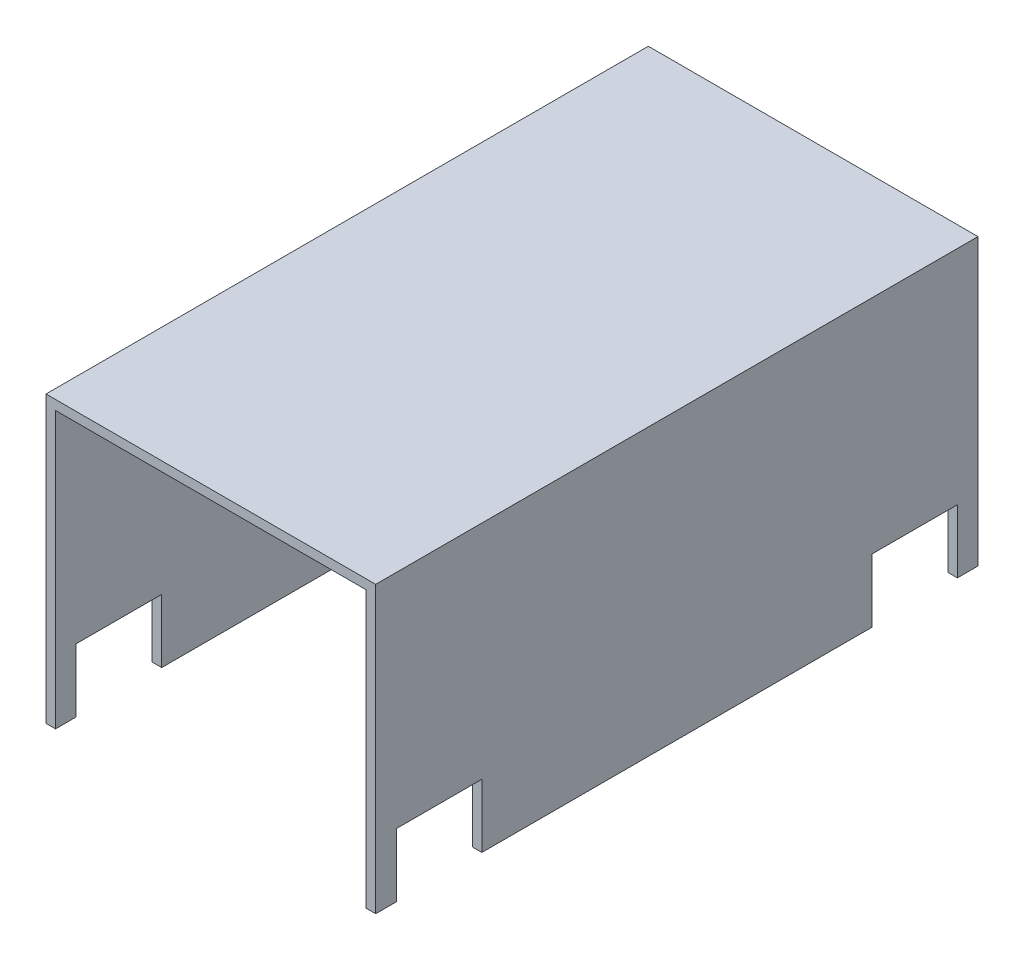
ISO-10303-21;
HEADER;
FILE_DESCRIPTION(('STEP AP214'),'2;1');
FILE_NAME('part.step','',(''),(''),'','','');
FILE_SCHEMA(('AUTOMOTIVE_DESIGN { 1 0 10303 214 1 1 1 1 }'));
ENDSEC;
DATA;
#1=APPLICATION_CONTEXT('core data for automotive mechanical design processes');
#2=APPLICATION_PROTOCOL_DEFINITION('international standard','automotive_design',2000,#1);
#3=PRODUCT_CONTEXT('',#1,'mechanical');
#4=PRODUCT('Part','Part','',(#3));
#5=PRODUCT_RELATED_PRODUCT_CATEGORY('part','',(#4));
#6=PRODUCT_DEFINITION_FORMATION('','',#4);
#7=PRODUCT_DEFINITION_CONTEXT('part definition',#1,'design');
#8=PRODUCT_DEFINITION('design','',#6,#7);
#9=PRODUCT_DEFINITION_SHAPE('','',#8);
#10=(LENGTH_UNIT() NAMED_UNIT(*) SI_UNIT(.MILLI.,.METRE.));
#11=(NAMED_UNIT(*) PLANE_ANGLE_UNIT() SI_UNIT($,.RADIAN.));
#12=(NAMED_UNIT(*) SI_UNIT($,.STERADIAN.) SOLID_ANGLE_UNIT());
#13=UNCERTAINTY_MEASURE_WITH_UNIT(LENGTH_MEASURE(1.E-05),#10,'distance_accuracy_value','');
#14=(GEOMETRIC_REPRESENTATION_CONTEXT(3) GLOBAL_UNCERTAINTY_ASSIGNED_CONTEXT((#13)) GLOBAL_UNIT_ASSIGNED_CONTEXT((#10,
#11,#12)) REPRESENTATION_CONTEXT('',''));
#15=CARTESIAN_POINT('',(0.,0.,0.));
#16=DIRECTION('',(0.,0.,1.));
#17=DIRECTION('',(1.,0.,0.));
#18=AXIS2_PLACEMENT_3D('',#15,#16,#17);
#19=CARTESIAN_POINT('',(52.,20.,-88.5));
#20=DIRECTION('',(0.,-1.,0.));
#21=DIRECTION('',(0.,0.,-1.));
#22=AXIS2_PLACEMENT_3D('',#19,#20,#21);
#23=PLANE('',#22);
#24=DIRECTION('',(0.,0.,1.));
#25=VECTOR('',#24,1.);
#26=CARTESIAN_POINT('',(49.,20.,3.25));
#27=LINE('',#26,#25);
#28=CARTESIAN_POINT('',(49.,20.,-88.5));
#29=VERTEX_POINT('',#28);
#30=CARTESIAN_POINT('',(49.,20.,-61.5));
#31=VERTEX_POINT('',#30);
#32=EDGE_CURVE('E40',#29,#31,#27,.T.);
#33=ORIENTED_EDGE('',*,*,#32,.F.);
#34=DIRECTION('',(-1.,0.,0.));
#35=VECTOR('',#34,1.);
#36=CARTESIAN_POINT('',(52.,20.,-88.5));
#37=LINE('',#36,#35);
#38=CARTESIAN_POINT('',(52.,20.,-88.5));
#39=VERTEX_POINT('',#38);
#40=EDGE_CURVE('E27',#39,#29,#37,.T.);
#41=ORIENTED_EDGE('',*,*,#40,.F.);
#42=DIRECTION('',(0.,0.,-1.));
#43=VECTOR('',#42,1.);
#44=CARTESIAN_POINT('',(52.,20.,3.25));
#45=LINE('',#44,#43);
#46=CARTESIAN_POINT('',(52.,20.,-61.5));
#47=VERTEX_POINT('',#46);
#48=EDGE_CURVE('E349',#47,#39,#45,.T.);
#49=ORIENTED_EDGE('',*,*,#48,.F.);
#50=DIRECTION('',(-1.,0.,0.));
#51=VECTOR('',#50,1.);
#52=CARTESIAN_POINT('',(52.,20.,-61.5));
#53=LINE('',#52,#51);
#54=EDGE_CURVE('E10',#47,#31,#53,.T.);
#55=ORIENTED_EDGE('',*,*,#54,.T.);
#56=EDGE_LOOP('',(#33,#41,#49,#55));
#57=FACE_BOUND('',#56,.T.);
#58=ADVANCED_FACE('F16',(#57),#23,.T.);
#59=CARTESIAN_POINT('',(52.,20.,-61.5));
#60=DIRECTION('',(0.,0.,-1.));
#61=DIRECTION('',(0.,-1.,0.));
#62=AXIS2_PLACEMENT_3D('',#59,#60,#61);
#63=PLANE('',#62);
#64=DIRECTION('',(0.,-1.,0.));
#65=VECTOR('',#64,1.);
#66=CARTESIAN_POINT('',(49.,53.5,-61.5));
#67=LINE('',#66,#65);
#68=CARTESIAN_POINT('',(49.,0.,-61.5));
#69=VERTEX_POINT('',#68);
#70=EDGE_CURVE('E205',#31,#69,#67,.T.);
#71=ORIENTED_EDGE('',*,*,#70,.F.);
#72=ORIENTED_EDGE('',*,*,#54,.F.);
#73=DIRECTION('',(0.,1.,0.));
#74=VECTOR('',#73,1.);
#75=CARTESIAN_POINT('',(52.,10.,-61.5));
#76=LINE('',#75,#74);
#77=CARTESIAN_POINT('',(52.,0.,-61.5));
#78=VERTEX_POINT('',#77);
#79=EDGE_CURVE('E348',#78,#47,#76,.T.);
#80=ORIENTED_EDGE('',*,*,#79,.F.);
#81=DIRECTION('',(1.,0.,0.));
#82=VECTOR('',#81,1.);
#83=CARTESIAN_POINT('',(26.,0.,-61.5));
#84=LINE('',#83,#82);
#85=EDGE_CURVE('E227',#69,#78,#84,.T.);
#86=ORIENTED_EDGE('',*,*,#85,.F.);
#87=EDGE_LOOP('',(#71,#72,#80,#86));
#88=FACE_BOUND('',#87,.T.);
#89=ADVANCED_FACE('F526',(#88),#63,.T.);
#90=CARTESIAN_POINT('',(52.,0.,-88.5));
#91=DIRECTION('',(0.,0.,1.));
#92=DIRECTION('',(0.,-1.,0.));
#93=AXIS2_PLACEMENT_3D('',#90,#91,#92);
#94=PLANE('',#93);
#95=DIRECTION('',(0.,1.,0.));
#96=VECTOR('',#95,1.);
#97=CARTESIAN_POINT('',(49.,43.5,-88.5));
#98=LINE('',#97,#96);
#99=CARTESIAN_POINT('',(49.,0.,-88.5));
#100=VERTEX_POINT('',#99);
#101=EDGE_CURVE('E249',#100,#29,#98,.T.);
#102=ORIENTED_EDGE('',*,*,#101,.F.);
#103=DIRECTION('',(-1.,0.,0.));
#104=VECTOR('',#103,1.);
#105=CARTESIAN_POINT('',(26.,0.,-88.5));
#106=LINE('',#105,#104);
#107=CARTESIAN_POINT('',(52.,0.,-88.5));
#108=VERTEX_POINT('',#107);
#109=EDGE_CURVE('E322',#108,#100,#106,.T.);
#110=ORIENTED_EDGE('',*,*,#109,.F.);
#111=DIRECTION('',(0.,-1.,0.));
#112=VECTOR('',#111,1.);
#113=CARTESIAN_POINT('',(52.,0.,-88.5));
#114=LINE('',#113,#112);
#115=EDGE_CURVE('E242',#39,#108,#114,.T.);
#116=ORIENTED_EDGE('',*,*,#115,.F.);
#117=ORIENTED_EDGE('',*,*,#40,.T.);
#118=EDGE_LOOP('',(#102,#110,#116,#117));
#119=FACE_BOUND('',#118,.T.);
#120=ADVANCED_FACE('F615',(#119),#94,.T.);
#121=CARTESIAN_POINT('',(52.,0.,-88.5));
#122=DIRECTION('',(0.,0.,1.));
#123=DIRECTION('',(0.,-1.,0.));
#124=AXIS2_PLACEMENT_3D('',#121,#122,#123);
#125=PLANE('',#124);
#126=DIRECTION('',(0.,-1.,0.));
#127=VECTOR('',#126,1.);
#128=CARTESIAN_POINT('',(-49.,0.,-88.5));
#129=LINE('',#128,#127);
#130=CARTESIAN_POINT('',(-49.,20.,-88.5));
#131=VERTEX_POINT('',#130);
#132=CARTESIAN_POINT('',(-49.,0.,-88.5));
#133=VERTEX_POINT('',#132);
#134=EDGE_CURVE('E372',#131,#133,#129,.T.);
#135=ORIENTED_EDGE('',*,*,#134,.F.);
#136=DIRECTION('',(-1.,0.,0.));
#137=VECTOR('',#136,1.);
#138=CARTESIAN_POINT('',(52.,20.,-88.5));
#139=LINE('',#138,#137);
#140=CARTESIAN_POINT('',(-52.,20.,-88.5));
#141=VERTEX_POINT('',#140);
#142=EDGE_CURVE('E266',#131,#141,#139,.T.);
#143=ORIENTED_EDGE('',*,*,#142,.T.);
#144=DIRECTION('',(0.,1.,0.));
#145=VECTOR('',#144,1.);
#146=CARTESIAN_POINT('',(-52.,0.,-88.5));
#147=LINE('',#146,#145);
#148=CARTESIAN_POINT('',(-52.,0.,-88.5));
#149=VERTEX_POINT('',#148);
#150=EDGE_CURVE('E211',#149,#141,#147,.T.);
#151=ORIENTED_EDGE('',*,*,#150,.F.);
#152=DIRECTION('',(-1.,0.,0.));
#153=VECTOR('',#152,1.);
#154=CARTESIAN_POINT('',(26.,0.,-88.5));
#155=LINE('',#154,#153);
#156=EDGE_CURVE('E314',#133,#149,#155,.T.);
#157=ORIENTED_EDGE('',*,*,#156,.F.);
#158=EDGE_LOOP('',(#135,#143,#151,#157));
#159=FACE_BOUND('',#158,.T.);
#160=ADVANCED_FACE('F620',(#159),#125,.T.);
#161=CARTESIAN_POINT('',(52.,20.,-61.5));
#162=DIRECTION('',(0.,0.,-1.));
#163=DIRECTION('',(0.,-1.,0.));
#164=AXIS2_PLACEMENT_3D('',#161,#162,#163);
#165=PLANE('',#164);
#166=DIRECTION('',(0.,1.,0.));
#167=VECTOR('',#166,1.);
#168=CARTESIAN_POINT('',(-49.,10.,-61.5));
#169=LINE('',#168,#167);
#170=CARTESIAN_POINT('',(-49.,0.,-61.5));
#171=VERTEX_POINT('',#170);
#172=CARTESIAN_POINT('',(-49.,20.,-61.5));
#173=VERTEX_POINT('',#172);
#174=EDGE_CURVE('E262',#171,#173,#169,.T.);
#175=ORIENTED_EDGE('',*,*,#174,.F.);
#176=DIRECTION('',(1.,0.,0.));
#177=VECTOR('',#176,1.);
#178=CARTESIAN_POINT('',(26.,0.,-61.5));
#179=LINE('',#178,#177);
#180=CARTESIAN_POINT('',(-52.,0.,-61.5));
#181=VERTEX_POINT('',#180);
#182=EDGE_CURVE('E341',#181,#171,#179,.T.);
#183=ORIENTED_EDGE('',*,*,#182,.F.);
#184=DIRECTION('',(0.,-1.,0.));
#185=VECTOR('',#184,1.);
#186=CARTESIAN_POINT('',(-52.,10.,-61.5));
#187=LINE('',#186,#185);
#188=CARTESIAN_POINT('',(-52.,20.,-61.5));
#189=VERTEX_POINT('',#188);
#190=EDGE_CURVE('E381',#189,#181,#187,.T.);
#191=ORIENTED_EDGE('',*,*,#190,.F.);
#192=DIRECTION('',(-1.,0.,0.));
#193=VECTOR('',#192,1.);
#194=CARTESIAN_POINT('',(52.,20.,-61.5));
#195=LINE('',#194,#193);
#196=EDGE_CURVE('E252',#173,#189,#195,.T.);
#197=ORIENTED_EDGE('',*,*,#196,.F.);
#198=EDGE_LOOP('',(#175,#183,#191,#197));
#199=FACE_BOUND('',#198,.T.);
#200=ADVANCED_FACE('F654',(#199),#165,.T.);
#201=CARTESIAN_POINT('',(52.,20.,-88.5));
#202=DIRECTION('',(0.,-1.,0.));
#203=DIRECTION('',(0.,0.,-1.));
#204=AXIS2_PLACEMENT_3D('',#201,#202,#203);
#205=PLANE('',#204);
#206=DIRECTION('',(0.,0.,-1.));
#207=VECTOR('',#206,1.);
#208=CARTESIAN_POINT('',(-49.,20.,3.25000000000004));
#209=LINE('',#208,#207);
#210=EDGE_CURVE('E310',#173,#131,#209,.T.);
#211=ORIENTED_EDGE('',*,*,#210,.F.);
#212=ORIENTED_EDGE('',*,*,#196,.T.);
#213=DIRECTION('',(0.,0.,1.));
#214=VECTOR('',#213,1.);
#215=CARTESIAN_POINT('',(-52.,20.,-91.75));
#216=LINE('',#215,#214);
#217=EDGE_CURVE('E385',#141,#189,#216,.T.);
#218=ORIENTED_EDGE('',*,*,#217,.F.);
#219=ORIENTED_EDGE('',*,*,#142,.F.);
#220=EDGE_LOOP('',(#211,#212,#218,#219));
#221=FACE_BOUND('',#220,.T.);
#222=ADVANCED_FACE('F673',(#221),#205,.T.);
#223=CARTESIAN_POINT('',(49.,87.,95.));
#224=DIRECTION('',(1.,0.,0.));
#225=DIRECTION('',(0.,1.,0.));
#226=AXIS2_PLACEMENT_3D('',#223,#224,#225);
#227=PLANE('',#226);
#228=ORIENTED_EDGE('',*,*,#101,.T.);
#229=ORIENTED_EDGE('',*,*,#32,.T.);
#230=ORIENTED_EDGE('',*,*,#70,.T.);
#231=DIRECTION('',(0.,0.,-1.));
#232=VECTOR('',#231,1.);
#233=CARTESIAN_POINT('',(49.,0.,47.5));
#234=LINE('',#233,#232);
#235=CARTESIAN_POINT('',(49.,0.,61.5));
#236=VERTEX_POINT('',#235);
#237=EDGE_CURVE('E197',#236,#69,#234,.T.);
#238=ORIENTED_EDGE('',*,*,#237,.F.);
#239=DIRECTION('',(0.,1.,0.));
#240=VECTOR('',#239,1.);
#241=CARTESIAN_POINT('',(49.,53.5,61.5));
#242=LINE('',#241,#240);
#243=CARTESIAN_POINT('',(49.,20.,61.5));
#244=VERTEX_POINT('',#243);
#245=EDGE_CURVE('E202',#236,#244,#242,.T.);
#246=ORIENTED_EDGE('',*,*,#245,.T.);
#247=DIRECTION('',(0.,0.,1.));
#248=VECTOR('',#247,1.);
#249=CARTESIAN_POINT('',(49.,20.,91.75));
#250=LINE('',#249,#248);
#251=CARTESIAN_POINT('',(49.,20.,88.5));
#252=VERTEX_POINT('',#251);
#253=EDGE_CURVE('E221',#244,#252,#250,.T.);
#254=ORIENTED_EDGE('',*,*,#253,.T.);
#255=DIRECTION('',(0.,-1.,0.));
#256=VECTOR('',#255,1.);
#257=CARTESIAN_POINT('',(49.,43.5,88.5));
#258=LINE('',#257,#256);
#259=CARTESIAN_POINT('',(49.,0.,88.5));
#260=VERTEX_POINT('',#259);
#261=EDGE_CURVE('E315',#252,#260,#258,.T.);
#262=ORIENTED_EDGE('',*,*,#261,.T.);
#263=DIRECTION('',(0.,0.,-1.));
#264=VECTOR('',#263,1.);
#265=CARTESIAN_POINT('',(49.,0.,47.5));
#266=LINE('',#265,#264);
#267=CARTESIAN_POINT('',(49.,0.,95.));
#268=VERTEX_POINT('',#267);
#269=EDGE_CURVE('E239',#268,#260,#266,.T.);
#270=ORIENTED_EDGE('',*,*,#269,.F.);
#271=DIRECTION('',(0.,-1.,0.));
#272=VECTOR('',#271,1.);
#273=CARTESIAN_POINT('',(49.,43.5,95.));
#274=LINE('',#273,#272);
#275=CARTESIAN_POINT('',(49.,87.,95.));
#276=VERTEX_POINT('',#275);
#277=EDGE_CURVE('E282',#276,#268,#274,.T.);
#278=ORIENTED_EDGE('',*,*,#277,.F.);
#279=DIRECTION('',(0.,0.,-1.));
#280=VECTOR('',#279,1.);
#281=CARTESIAN_POINT('',(49.,87.,95.));
#282=LINE('',#281,#280);
#283=CARTESIAN_POINT('',(49.,87.,-95.));
#284=VERTEX_POINT('',#283);
#285=EDGE_CURVE('E233',#276,#284,#282,.T.);
#286=ORIENTED_EDGE('',*,*,#285,.T.);
#287=DIRECTION('',(0.,1.,0.));
#288=VECTOR('',#287,1.);
#289=CARTESIAN_POINT('',(49.,43.5,-95.));
#290=LINE('',#289,#288);
#291=CARTESIAN_POINT('',(49.,0.,-95.));
#292=VERTEX_POINT('',#291);
#293=EDGE_CURVE('E287',#292,#284,#290,.T.);
#294=ORIENTED_EDGE('',*,*,#293,.F.);
#295=DIRECTION('',(0.,0.,-1.));
#296=VECTOR('',#295,1.);
#297=CARTESIAN_POINT('',(49.,0.,47.5));
#298=LINE('',#297,#296);
#299=EDGE_CURVE('E319',#100,#292,#298,.T.);
#300=ORIENTED_EDGE('',*,*,#299,.F.);
#301=EDGE_LOOP('',(#228,#229,#230,#238,#246,#254,#262,#270,#278,#286,#294,#300));
#302=FACE_BOUND('',#301,.T.);
#303=ADVANCED_FACE('F200',(#302),#227,.F.);
#304=CARTESIAN_POINT('',(0.,0.,0.));
#305=DIRECTION('',(0.,1.,0.));
#306=DIRECTION('',(1.,0.,0.));
#307=AXIS2_PLACEMENT_3D('',#304,#305,#306);
#308=PLANE('',#307);
#309=ORIENTED_EDGE('',*,*,#85,.T.);
#310=DIRECTION('',(0.,0.,-1.));
#311=VECTOR('',#310,1.);
#312=CARTESIAN_POINT('',(52.,0.,95.));
#313=LINE('',#312,#311);
#314=CARTESIAN_POINT('',(52.,0.,61.5));
#315=VERTEX_POINT('',#314);
#316=EDGE_CURVE('E225',#315,#78,#313,.T.);
#317=ORIENTED_EDGE('',*,*,#316,.F.);
#318=DIRECTION('',(-1.,0.,0.));
#319=VECTOR('',#318,1.);
#320=CARTESIAN_POINT('',(26.,0.,61.5));
#321=LINE('',#320,#319);
#322=EDGE_CURVE('E210',#315,#236,#321,.T.);
#323=ORIENTED_EDGE('',*,*,#322,.T.);
#324=ORIENTED_EDGE('',*,*,#237,.T.);
#325=EDGE_LOOP('',(#309,#317,#323,#324));
#326=FACE_BOUND('',#325,.T.);
#327=ADVANCED_FACE('F223',(#326),#308,.F.);
#328=CARTESIAN_POINT('',(-52.,0.,-95.));
#329=DIRECTION('',(-1.,0.,0.));
#330=DIRECTION('',(0.,1.,0.));
#331=AXIS2_PLACEMENT_3D('',#328,#329,#330);
#332=PLANE('',#331);
#333=ORIENTED_EDGE('',*,*,#150,.T.);
#334=ORIENTED_EDGE('',*,*,#217,.T.);
#335=ORIENTED_EDGE('',*,*,#190,.T.);
#336=DIRECTION('',(0.,0.,1.));
#337=VECTOR('',#336,1.);
#338=CARTESIAN_POINT('',(-52.,0.,-95.));
#339=LINE('',#338,#337);
#340=CARTESIAN_POINT('',(-52.,0.,61.5));
#341=VERTEX_POINT('',#340);
#342=EDGE_CURVE('E296',#181,#341,#339,.T.);
#343=ORIENTED_EDGE('',*,*,#342,.T.);
#344=DIRECTION('',(0.,1.,0.));
#345=VECTOR('',#344,1.);
#346=CARTESIAN_POINT('',(-52.,10.,61.5));
#347=LINE('',#346,#345);
#348=CARTESIAN_POINT('',(-52.,20.,61.5));
#349=VERTEX_POINT('',#348);
#350=EDGE_CURVE('E292',#341,#349,#347,.T.);
#351=ORIENTED_EDGE('',*,*,#350,.T.);
#352=DIRECTION('',(0.,0.,1.));
#353=VECTOR('',#352,1.);
#354=CARTESIAN_POINT('',(-52.,20.,-3.25));
#355=LINE('',#354,#353);
#356=CARTESIAN_POINT('',(-52.,20.,88.5));
#357=VERTEX_POINT('',#356);
#358=EDGE_CURVE('E271',#349,#357,#355,.T.);
#359=ORIENTED_EDGE('',*,*,#358,.T.);
#360=DIRECTION('',(0.,-1.,0.));
#361=VECTOR('',#360,1.);
#362=CARTESIAN_POINT('',(-52.,0.,88.5));
#363=LINE('',#362,#361);
#364=CARTESIAN_POINT('',(-52.,0.,88.5));
#365=VERTEX_POINT('',#364);
#366=EDGE_CURVE('E267',#357,#365,#363,.T.);
#367=ORIENTED_EDGE('',*,*,#366,.T.);
#368=DIRECTION('',(0.,0.,1.));
#369=VECTOR('',#368,1.);
#370=CARTESIAN_POINT('',(-52.,0.,-95.));
#371=LINE('',#370,#369);
#372=CARTESIAN_POINT('',(-52.,0.,95.));
#373=VERTEX_POINT('',#372);
#374=EDGE_CURVE('E272',#365,#373,#371,.T.);
#375=ORIENTED_EDGE('',*,*,#374,.T.);
#376=DIRECTION('',(0.,1.,0.));
#377=VECTOR('',#376,1.);
#378=CARTESIAN_POINT('',(-52.,0.,95.));
#379=LINE('',#378,#377);
#380=CARTESIAN_POINT('',(-52.,90.,95.));
#381=VERTEX_POINT('',#380);
#382=EDGE_CURVE('E286',#373,#381,#379,.T.);
#383=ORIENTED_EDGE('',*,*,#382,.T.);
#384=DIRECTION('',(0.,0.,1.));
#385=VECTOR('',#384,1.);
#386=CARTESIAN_POINT('',(-52.,90.,-95.));
#387=LINE('',#386,#385);
#388=CARTESIAN_POINT('',(-52.,90.,-95.));
#389=VERTEX_POINT('',#388);
#390=EDGE_CURVE('E333',#389,#381,#387,.T.);
#391=ORIENTED_EDGE('',*,*,#390,.F.);
#392=DIRECTION('',(0.,1.,0.));
#393=VECTOR('',#392,1.);
#394=CARTESIAN_POINT('',(-52.,0.,-95.));
#395=LINE('',#394,#393);
#396=CARTESIAN_POINT('',(-52.,0.,-95.));
#397=VERTEX_POINT('',#396);
#398=EDGE_CURVE('E393',#397,#389,#395,.T.);
#399=ORIENTED_EDGE('',*,*,#398,.F.);
#400=DIRECTION('',(0.,0.,1.));
#401=VECTOR('',#400,1.);
#402=CARTESIAN_POINT('',(-52.,0.,-95.));
#403=LINE('',#402,#401);
#404=EDGE_CURVE('E300',#397,#149,#403,.T.);
#405=ORIENTED_EDGE('',*,*,#404,.T.);
#406=EDGE_LOOP('',(#333,#334,#335,#343,#351,#359,#367,#375,#383,#391,#399,#405));
#407=FACE_BOUND('',#406,.T.);
#408=ADVANCED_FACE('F662',(#407),#332,.T.);
#409=CARTESIAN_POINT('',(0.,0.,0.));
#410=DIRECTION('',(0.,1.,0.));
#411=DIRECTION('',(1.,0.,0.));
#412=AXIS2_PLACEMENT_3D('',#409,#410,#411);
#413=PLANE('',#412);
#414=ORIENTED_EDGE('',*,*,#182,.T.);
#415=DIRECTION('',(0.,0.,1.));
#416=VECTOR('',#415,1.);
#417=CARTESIAN_POINT('',(-49.,0.,47.5));
#418=LINE('',#417,#416);
#419=CARTESIAN_POINT('',(-49.,0.,61.5));
#420=VERTEX_POINT('',#419);
#421=EDGE_CURVE('E277',#171,#420,#418,.T.);
#422=ORIENTED_EDGE('',*,*,#421,.T.);
#423=DIRECTION('',(-1.,0.,0.));
#424=VECTOR('',#423,1.);
#425=CARTESIAN_POINT('',(26.,0.,61.5));
#426=LINE('',#425,#424);
#427=EDGE_CURVE('E273',#420,#341,#426,.T.);
#428=ORIENTED_EDGE('',*,*,#427,.T.);
#429=ORIENTED_EDGE('',*,*,#342,.F.);
#430=EDGE_LOOP('',(#414,#422,#428,#429));
#431=FACE_BOUND('',#430,.T.);
#432=ADVANCED_FACE('F643',(#431),#413,.F.);
#433=CARTESIAN_POINT('',(52.,20.,88.5));
#434=DIRECTION('',(0.,1.,0.));
#435=DIRECTION('',(1.,0.,0.));
#436=AXIS2_PLACEMENT_3D('',#433,#434,#435);
#437=PLANE('',#436);
#438=ORIENTED_EDGE('',*,*,#253,.F.);
#439=DIRECTION('',(-1.,0.,0.));
#440=VECTOR('',#439,1.);
#441=CARTESIAN_POINT('',(52.,20.,61.5));
#442=LINE('',#441,#440);
#443=CARTESIAN_POINT('',(52.,20.,61.5));
#444=VERTEX_POINT('',#443);
#445=EDGE_CURVE('E219',#444,#244,#442,.T.);
#446=ORIENTED_EDGE('',*,*,#445,.F.);
#447=DIRECTION('',(0.,0.,-1.));
#448=VECTOR('',#447,1.);
#449=CARTESIAN_POINT('',(52.,20.,91.75));
#450=LINE('',#449,#448);
#451=CARTESIAN_POINT('',(52.,20.,88.5));
#452=VERTEX_POINT('',#451);
#453=EDGE_CURVE('E390',#452,#444,#450,.T.);
#454=ORIENTED_EDGE('',*,*,#453,.F.);
#455=DIRECTION('',(-1.,0.,0.));
#456=VECTOR('',#455,1.);
#457=CARTESIAN_POINT('',(52.,20.,88.5));
#458=LINE('',#457,#456);
#459=EDGE_CURVE('E278',#452,#252,#458,.T.);
#460=ORIENTED_EDGE('',*,*,#459,.T.);
#461=EDGE_LOOP('',(#438,#446,#454,#460));
#462=FACE_BOUND('',#461,.T.);
#463=ADVANCED_FACE('F519',(#462),#437,.F.);
#464=CARTESIAN_POINT('',(52.,20.,88.5));
#465=DIRECTION('',(0.,1.,0.));
#466=DIRECTION('',(1.,0.,0.));
#467=AXIS2_PLACEMENT_3D('',#464,#465,#466);
#468=PLANE('',#467);
#469=DIRECTION('',(0.,0.,-1.));
#470=VECTOR('',#469,1.);
#471=CARTESIAN_POINT('',(-49.,20.,91.75));
#472=LINE('',#471,#470);
#473=CARTESIAN_POINT('',(-49.,20.,88.5));
#474=VERTEX_POINT('',#473);
#475=CARTESIAN_POINT('',(-49.,20.,61.5));
#476=VERTEX_POINT('',#475);
#477=EDGE_CURVE('E244',#474,#476,#472,.T.);
#478=ORIENTED_EDGE('',*,*,#477,.F.);
#479=DIRECTION('',(-1.,0.,0.));
#480=VECTOR('',#479,1.);
#481=CARTESIAN_POINT('',(52.,20.,88.5));
#482=LINE('',#481,#480);
#483=EDGE_CURVE('E440',#474,#357,#482,.T.);
#484=ORIENTED_EDGE('',*,*,#483,.T.);
#485=ORIENTED_EDGE('',*,*,#358,.F.);
#486=DIRECTION('',(-1.,0.,0.));
#487=VECTOR('',#486,1.);
#488=CARTESIAN_POINT('',(52.,20.,61.5));
#489=LINE('',#488,#487);
#490=EDGE_CURVE('E441',#476,#349,#489,.T.);
#491=ORIENTED_EDGE('',*,*,#490,.F.);
#492=EDGE_LOOP('',(#478,#484,#485,#491));
#493=FACE_BOUND('',#492,.T.);
#494=ADVANCED_FACE('F642',(#493),#468,.F.);
#495=CARTESIAN_POINT('',(52.,20.,61.5));
#496=DIRECTION('',(0.,0.,-1.));
#497=DIRECTION('',(0.,-1.,0.));
#498=AXIS2_PLACEMENT_3D('',#495,#496,#497);
#499=PLANE('',#498);
#500=ORIENTED_EDGE('',*,*,#245,.F.);
#501=ORIENTED_EDGE('',*,*,#322,.F.);
#502=DIRECTION('',(0.,-1.,0.));
#503=VECTOR('',#502,1.);
#504=CARTESIAN_POINT('',(52.,10.,61.5));
#505=LINE('',#504,#503);
#506=EDGE_CURVE('E347',#444,#315,#505,.T.);
#507=ORIENTED_EDGE('',*,*,#506,.F.);
#508=ORIENTED_EDGE('',*,*,#445,.T.);
#509=EDGE_LOOP('',(#500,#501,#507,#508));
#510=FACE_BOUND('',#509,.T.);
#511=ADVANCED_FACE('F215',(#510),#499,.F.);
#512=CARTESIAN_POINT('',(52.,20.,61.5));
#513=DIRECTION('',(0.,0.,-1.));
#514=DIRECTION('',(0.,-1.,0.));
#515=AXIS2_PLACEMENT_3D('',#512,#513,#514);
#516=PLANE('',#515);
#517=DIRECTION('',(0.,-1.,0.));
#518=VECTOR('',#517,1.);
#519=CARTESIAN_POINT('',(-49.,10.,61.5));
#520=LINE('',#519,#518);
#521=EDGE_CURVE('E248',#476,#420,#520,.T.);
#522=ORIENTED_EDGE('',*,*,#521,.F.);
#523=ORIENTED_EDGE('',*,*,#490,.T.);
#524=ORIENTED_EDGE('',*,*,#350,.F.);
#525=ORIENTED_EDGE('',*,*,#427,.F.);
#526=EDGE_LOOP('',(#522,#523,#524,#525));
#527=FACE_BOUND('',#526,.T.);
#528=ADVANCED_FACE('F585',(#527),#516,.F.);
#529=CARTESIAN_POINT('',(52.,0.,88.5));
#530=DIRECTION('',(0.,0.,1.));
#531=DIRECTION('',(0.,-1.,0.));
#532=AXIS2_PLACEMENT_3D('',#529,#530,#531);
#533=PLANE('',#532);
#534=ORIENTED_EDGE('',*,*,#261,.F.);
#535=ORIENTED_EDGE('',*,*,#459,.F.);
#536=DIRECTION('',(0.,1.,0.));
#537=VECTOR('',#536,1.);
#538=CARTESIAN_POINT('',(52.,0.,88.5));
#539=LINE('',#538,#537);
#540=CARTESIAN_POINT('',(52.,0.,88.5));
#541=VERTEX_POINT('',#540);
#542=EDGE_CURVE('E20',#541,#452,#539,.T.);
#543=ORIENTED_EDGE('',*,*,#542,.F.);
#544=DIRECTION('',(1.,0.,0.));
#545=VECTOR('',#544,1.);
#546=CARTESIAN_POINT('',(26.,0.,88.5));
#547=LINE('',#546,#545);
#548=EDGE_CURVE('E241',#260,#541,#547,.T.);
#549=ORIENTED_EDGE('',*,*,#548,.F.);
#550=EDGE_LOOP('',(#534,#535,#543,#549));
#551=FACE_BOUND('',#550,.T.);
#552=ADVANCED_FACE('F514',(#551),#533,.F.);
#553=CARTESIAN_POINT('',(52.,0.,88.5));
#554=DIRECTION('',(0.,0.,1.));
#555=DIRECTION('',(0.,-1.,0.));
#556=AXIS2_PLACEMENT_3D('',#553,#554,#555);
#557=PLANE('',#556);
#558=DIRECTION('',(0.,1.,0.));
#559=VECTOR('',#558,1.);
#560=CARTESIAN_POINT('',(-49.,0.,88.5));
#561=LINE('',#560,#559);
#562=CARTESIAN_POINT('',(-49.,0.,88.5));
#563=VERTEX_POINT('',#562);
#564=EDGE_CURVE('E247',#563,#474,#561,.T.);
#565=ORIENTED_EDGE('',*,*,#564,.F.);
#566=DIRECTION('',(1.,0.,0.));
#567=VECTOR('',#566,1.);
#568=CARTESIAN_POINT('',(26.,0.,88.5));
#569=LINE('',#568,#567);
#570=EDGE_CURVE('E323',#365,#563,#569,.T.);
#571=ORIENTED_EDGE('',*,*,#570,.F.);
#572=ORIENTED_EDGE('',*,*,#366,.F.);
#573=ORIENTED_EDGE('',*,*,#483,.F.);
#574=EDGE_LOOP('',(#565,#571,#572,#573));
#575=FACE_BOUND('',#574,.T.);
#576=ADVANCED_FACE('F705',(#575),#557,.F.);
#577=CARTESIAN_POINT('',(-49.,0.,95.));
#578=DIRECTION('',(-1.,0.,0.));
#579=DIRECTION('',(0.,1.,0.));
#580=AXIS2_PLACEMENT_3D('',#577,#578,#579);
#581=PLANE('',#580);
#582=ORIENTED_EDGE('',*,*,#134,.T.);
#583=DIRECTION('',(0.,0.,1.));
#584=VECTOR('',#583,1.);
#585=CARTESIAN_POINT('',(-49.,0.,47.5));
#586=LINE('',#585,#584);
#587=CARTESIAN_POINT('',(-49.,0.,-95.));
#588=VERTEX_POINT('',#587);
#589=EDGE_CURVE('E325',#588,#133,#586,.T.);
#590=ORIENTED_EDGE('',*,*,#589,.F.);
#591=DIRECTION('',(0.,-1.,0.));
#592=VECTOR('',#591,1.);
#593=CARTESIAN_POINT('',(-49.,0.,-95.));
#594=LINE('',#593,#592);
#595=CARTESIAN_POINT('',(-49.,87.,-95.));
#596=VERTEX_POINT('',#595);
#597=EDGE_CURVE('E237',#596,#588,#594,.T.);
#598=ORIENTED_EDGE('',*,*,#597,.F.);
#599=DIRECTION('',(0.,0.,-1.));
#600=VECTOR('',#599,1.);
#601=CARTESIAN_POINT('',(-49.,87.,95.));
#602=LINE('',#601,#600);
#603=CARTESIAN_POINT('',(-49.,87.,95.));
#604=VERTEX_POINT('',#603);
#605=EDGE_CURVE('E352',#604,#596,#602,.T.);
#606=ORIENTED_EDGE('',*,*,#605,.F.);
#607=DIRECTION('',(0.,1.,0.));
#608=VECTOR('',#607,1.);
#609=CARTESIAN_POINT('',(-49.,0.,95.));
#610=LINE('',#609,#608);
#611=CARTESIAN_POINT('',(-49.,0.,95.));
#612=VERTEX_POINT('',#611);
#613=EDGE_CURVE('E164',#612,#604,#610,.T.);
#614=ORIENTED_EDGE('',*,*,#613,.F.);
#615=DIRECTION('',(0.,0.,1.));
#616=VECTOR('',#615,1.);
#617=CARTESIAN_POINT('',(-49.,0.,47.5));
#618=LINE('',#617,#616);
#619=EDGE_CURVE('E303',#563,#612,#618,.T.);
#620=ORIENTED_EDGE('',*,*,#619,.F.);
#621=ORIENTED_EDGE('',*,*,#564,.T.);
#622=ORIENTED_EDGE('',*,*,#477,.T.);
#623=ORIENTED_EDGE('',*,*,#521,.T.);
#624=ORIENTED_EDGE('',*,*,#421,.F.);
#625=ORIENTED_EDGE('',*,*,#174,.T.);
#626=ORIENTED_EDGE('',*,*,#210,.T.);
#627=EDGE_LOOP('',(#582,#590,#598,#606,#614,#620,#621,#622,#623,#624,#625,#626));
#628=FACE_BOUND('',#627,.T.);
#629=ADVANCED_FACE('F742',(#628),#581,.F.);
#630=CARTESIAN_POINT('',(0.,0.,0.));
#631=DIRECTION('',(0.,1.,0.));
#632=DIRECTION('',(1.,0.,0.));
#633=AXIS2_PLACEMENT_3D('',#630,#631,#632);
#634=PLANE('',#633);
#635=ORIENTED_EDGE('',*,*,#156,.T.);
#636=ORIENTED_EDGE('',*,*,#404,.F.);
#637=DIRECTION('',(-1.,0.,0.));
#638=VECTOR('',#637,1.);
#639=CARTESIAN_POINT('',(52.,0.,-95.));
#640=LINE('',#639,#638);
#641=EDGE_CURVE('E434',#588,#397,#640,.T.);
#642=ORIENTED_EDGE('',*,*,#641,.F.);
#643=ORIENTED_EDGE('',*,*,#589,.T.);
#644=EDGE_LOOP('',(#635,#636,#642,#643));
#645=FACE_BOUND('',#644,.T.);
#646=ADVANCED_FACE('F737',(#645),#634,.F.);
#647=CARTESIAN_POINT('',(0.,0.,0.));
#648=DIRECTION('',(0.,1.,0.));
#649=DIRECTION('',(1.,0.,0.));
#650=AXIS2_PLACEMENT_3D('',#647,#648,#649);
#651=PLANE('',#650);
#652=ORIENTED_EDGE('',*,*,#548,.T.);
#653=DIRECTION('',(0.,0.,-1.));
#654=VECTOR('',#653,1.);
#655=CARTESIAN_POINT('',(52.,0.,95.));
#656=LINE('',#655,#654);
#657=CARTESIAN_POINT('',(52.,0.,95.));
#658=VERTEX_POINT('',#657);
#659=EDGE_CURVE('E404',#658,#541,#656,.T.);
#660=ORIENTED_EDGE('',*,*,#659,.F.);
#661=DIRECTION('',(1.,0.,0.));
#662=VECTOR('',#661,1.);
#663=CARTESIAN_POINT('',(-52.,0.,95.));
#664=LINE('',#663,#662);
#665=EDGE_CURVE('E279',#268,#658,#664,.T.);
#666=ORIENTED_EDGE('',*,*,#665,.F.);
#667=ORIENTED_EDGE('',*,*,#269,.T.);
#668=EDGE_LOOP('',(#652,#660,#666,#667));
#669=FACE_BOUND('',#668,.T.);
#670=ADVANCED_FACE('F402',(#669),#651,.F.);
#671=CARTESIAN_POINT('',(52.,0.,95.));
#672=DIRECTION('',(1.,0.,0.));
#673=DIRECTION('',(0.,0.,1.));
#674=AXIS2_PLACEMENT_3D('',#671,#672,#673);
#675=PLANE('',#674);
#676=ORIENTED_EDGE('',*,*,#115,.T.);
#677=DIRECTION('',(0.,0.,-1.));
#678=VECTOR('',#677,1.);
#679=CARTESIAN_POINT('',(52.,0.,95.));
#680=LINE('',#679,#678);
#681=CARTESIAN_POINT('',(52.,0.,-95.));
#682=VERTEX_POINT('',#681);
#683=EDGE_CURVE('E424',#108,#682,#680,.T.);
#684=ORIENTED_EDGE('',*,*,#683,.T.);
#685=DIRECTION('',(0.,1.,0.));
#686=VECTOR('',#685,1.);
#687=CARTESIAN_POINT('',(52.,0.,-95.));
#688=LINE('',#687,#686);
#689=CARTESIAN_POINT('',(52.,90.,-95.));
#690=VERTEX_POINT('',#689);
#691=EDGE_CURVE('E417',#682,#690,#688,.T.);
#692=ORIENTED_EDGE('',*,*,#691,.T.);
#693=DIRECTION('',(0.,0.,-1.));
#694=VECTOR('',#693,1.);
#695=CARTESIAN_POINT('',(52.,90.,95.));
#696=LINE('',#695,#694);
#697=CARTESIAN_POINT('',(52.,90.,95.));
#698=VERTEX_POINT('',#697);
#699=EDGE_CURVE('E309',#698,#690,#696,.T.);
#700=ORIENTED_EDGE('',*,*,#699,.F.);
#701=DIRECTION('',(0.,1.,0.));
#702=VECTOR('',#701,1.);
#703=CARTESIAN_POINT('',(52.,0.,95.));
#704=LINE('',#703,#702);
#705=EDGE_CURVE('E258',#658,#698,#704,.T.);
#706=ORIENTED_EDGE('',*,*,#705,.F.);
#707=ORIENTED_EDGE('',*,*,#659,.T.);
#708=ORIENTED_EDGE('',*,*,#542,.T.);
#709=ORIENTED_EDGE('',*,*,#453,.T.);
#710=ORIENTED_EDGE('',*,*,#506,.T.);
#711=ORIENTED_EDGE('',*,*,#316,.T.);
#712=ORIENTED_EDGE('',*,*,#79,.T.);
#713=ORIENTED_EDGE('',*,*,#48,.T.);
#714=EDGE_LOOP('',(#676,#684,#692,#700,#706,#707,#708,#709,#710,#711,#712,#713));
#715=FACE_BOUND('',#714,.T.);
#716=ADVANCED_FACE('F415',(#715),#675,.T.);
#717=CARTESIAN_POINT('',(-49.,87.,95.));
#718=DIRECTION('',(0.,1.,0.));
#719=DIRECTION('',(1.,0.,0.));
#720=AXIS2_PLACEMENT_3D('',#717,#718,#719);
#721=PLANE('',#720);
#722=DIRECTION('',(-1.,0.,0.));
#723=VECTOR('',#722,1.);
#724=CARTESIAN_POINT('',(1.49999999999997,87.,-95.));
#725=LINE('',#724,#723);
#726=EDGE_CURVE('E291',#284,#596,#725,.T.);
#727=ORIENTED_EDGE('',*,*,#726,.F.);
#728=ORIENTED_EDGE('',*,*,#285,.F.);
#729=DIRECTION('',(1.,0.,0.));
#730=VECTOR('',#729,1.);
#731=CARTESIAN_POINT('',(-50.5,87.,95.));
#732=LINE('',#731,#730);
#733=EDGE_CURVE('E304',#604,#276,#732,.T.);
#734=ORIENTED_EDGE('',*,*,#733,.F.);
#735=ORIENTED_EDGE('',*,*,#605,.T.);
#736=EDGE_LOOP('',(#727,#728,#734,#735));
#737=FACE_BOUND('',#736,.T.);
#738=ADVANCED_FACE('F18',(#737),#721,.F.);
#739=CARTESIAN_POINT('',(0.,0.,0.));
#740=DIRECTION('',(0.,1.,0.));
#741=DIRECTION('',(1.,0.,0.));
#742=AXIS2_PLACEMENT_3D('',#739,#740,#741);
#743=PLANE('',#742);
#744=ORIENTED_EDGE('',*,*,#109,.T.);
#745=ORIENTED_EDGE('',*,*,#299,.T.);
#746=DIRECTION('',(-1.,0.,0.));
#747=VECTOR('',#746,1.);
#748=CARTESIAN_POINT('',(52.,0.,-95.));
#749=LINE('',#748,#747);
#750=EDGE_CURVE('E290',#682,#292,#749,.T.);
#751=ORIENTED_EDGE('',*,*,#750,.F.);
#752=ORIENTED_EDGE('',*,*,#683,.F.);
#753=EDGE_LOOP('',(#744,#745,#751,#752));
#754=FACE_BOUND('',#753,.T.);
#755=ADVANCED_FACE('F501',(#754),#743,.F.);
#756=CARTESIAN_POINT('',(0.,0.,0.));
#757=DIRECTION('',(0.,1.,0.));
#758=DIRECTION('',(1.,0.,0.));
#759=AXIS2_PLACEMENT_3D('',#756,#757,#758);
#760=PLANE('',#759);
#761=ORIENTED_EDGE('',*,*,#570,.T.);
#762=ORIENTED_EDGE('',*,*,#619,.T.);
#763=DIRECTION('',(1.,0.,0.));
#764=VECTOR('',#763,1.);
#765=CARTESIAN_POINT('',(-52.,0.,95.));
#766=LINE('',#765,#764);
#767=EDGE_CURVE('E255',#373,#612,#766,.T.);
#768=ORIENTED_EDGE('',*,*,#767,.F.);
#769=ORIENTED_EDGE('',*,*,#374,.F.);
#770=EDGE_LOOP('',(#761,#762,#768,#769));
#771=FACE_BOUND('',#770,.T.);
#772=ADVANCED_FACE('F578',(#771),#760,.F.);
#773=CARTESIAN_POINT('',(-52.,0.,95.));
#774=DIRECTION('',(0.,0.,1.));
#775=DIRECTION('',(1.,0.,0.));
#776=AXIS2_PLACEMENT_3D('',#773,#774,#775);
#777=PLANE('',#776);
#778=ORIENTED_EDGE('',*,*,#613,.T.);
#779=ORIENTED_EDGE('',*,*,#733,.T.);
#780=ORIENTED_EDGE('',*,*,#277,.T.);
#781=ORIENTED_EDGE('',*,*,#665,.T.);
#782=ORIENTED_EDGE('',*,*,#705,.T.);
#783=DIRECTION('',(1.,0.,0.));
#784=VECTOR('',#783,1.);
#785=CARTESIAN_POINT('',(-52.,90.,95.));
#786=LINE('',#785,#784);
#787=EDGE_CURVE('E305',#381,#698,#786,.T.);
#788=ORIENTED_EDGE('',*,*,#787,.F.);
#789=ORIENTED_EDGE('',*,*,#382,.F.);
#790=ORIENTED_EDGE('',*,*,#767,.T.);
#791=EDGE_LOOP('',(#778,#779,#780,#781,#782,#788,#789,#790));
#792=FACE_BOUND('',#791,.T.);
#793=ADVANCED_FACE('F510',(#792),#777,.T.);
#794=CARTESIAN_POINT('',(52.,0.,-95.));
#795=DIRECTION('',(0.,0.,-1.));
#796=DIRECTION('',(-1.,0.,0.));
#797=AXIS2_PLACEMENT_3D('',#794,#795,#796);
#798=PLANE('',#797);
#799=ORIENTED_EDGE('',*,*,#597,.T.);
#800=ORIENTED_EDGE('',*,*,#641,.T.);
#801=ORIENTED_EDGE('',*,*,#398,.T.);
#802=DIRECTION('',(-1.,0.,0.));
#803=VECTOR('',#802,1.);
#804=CARTESIAN_POINT('',(52.,90.,-95.));
#805=LINE('',#804,#803);
#806=EDGE_CURVE('E329',#690,#389,#805,.T.);
#807=ORIENTED_EDGE('',*,*,#806,.F.);
#808=ORIENTED_EDGE('',*,*,#691,.F.);
#809=ORIENTED_EDGE('',*,*,#750,.T.);
#810=ORIENTED_EDGE('',*,*,#293,.T.);
#811=ORIENTED_EDGE('',*,*,#726,.T.);
#812=EDGE_LOOP('',(#799,#800,#801,#807,#808,#809,#810,#811));
#813=FACE_BOUND('',#812,.T.);
#814=ADVANCED_FACE('F504',(#813),#798,.T.);
#815=CARTESIAN_POINT('',(0.,90.,0.));
#816=DIRECTION('',(0.,1.,0.));
#817=DIRECTION('',(1.,0.,0.));
#818=AXIS2_PLACEMENT_3D('',#815,#816,#817);
#819=PLANE('',#818);
#820=ORIENTED_EDGE('',*,*,#787,.T.);
#821=ORIENTED_EDGE('',*,*,#699,.T.);
#822=ORIENTED_EDGE('',*,*,#806,.T.);
#823=ORIENTED_EDGE('',*,*,#390,.T.);
#824=EDGE_LOOP('',(#820,#821,#822,#823));
#825=FACE_BOUND('',#824,.T.);
#826=ADVANCED_FACE('F508',(#825),#819,.T.);
#827=CLOSED_SHELL('',(#58,#89,#120,#160,#200,#222,#303,#327,#408,#432,#463,#494,#511,#528,#552,
#576,#629,#646,#670,#716,#738,#755,#772,#793,#814,#826));
#828=MANIFOLD_SOLID_BREP('B1',#827);
#829=ADVANCED_BREP_SHAPE_REPRESENTATION('',(#18,#828),#14);
#830=SHAPE_DEFINITION_REPRESENTATION(#9,#829);
ENDSEC;
END-ISO-10303-21;
